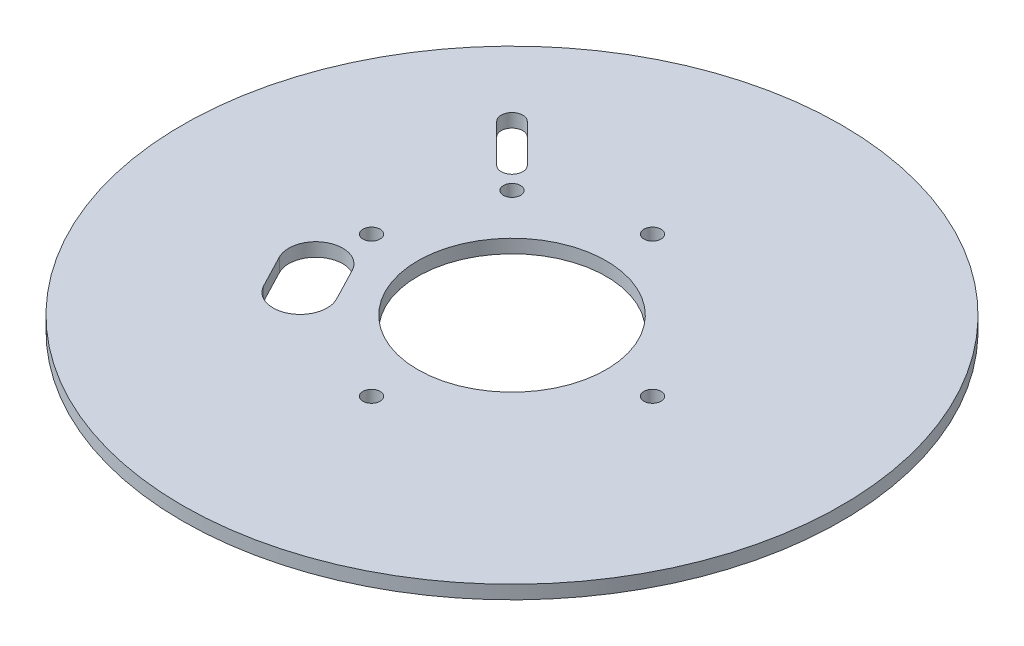
ISO-10303-21;
HEADER;
FILE_DESCRIPTION(('STEP AP214'),'2;1');
FILE_NAME('part.step','',(''),(''),'','','');
FILE_SCHEMA(('AUTOMOTIVE_DESIGN { 1 0 10303 214 1 1 1 1 }'));
ENDSEC;
DATA;
#1=APPLICATION_CONTEXT('core data for automotive mechanical design processes');
#2=APPLICATION_PROTOCOL_DEFINITION('international standard','automotive_design',2000,#1);
#3=PRODUCT_CONTEXT('',#1,'mechanical');
#4=PRODUCT('Part','Part','',(#3));
#5=PRODUCT_RELATED_PRODUCT_CATEGORY('part','',(#4));
#6=PRODUCT_DEFINITION_FORMATION('','',#4);
#7=PRODUCT_DEFINITION_CONTEXT('part definition',#1,'design');
#8=PRODUCT_DEFINITION('design','',#6,#7);
#9=PRODUCT_DEFINITION_SHAPE('','',#8);
#10=(LENGTH_UNIT() NAMED_UNIT(*) SI_UNIT(.MILLI.,.METRE.));
#11=(NAMED_UNIT(*) PLANE_ANGLE_UNIT() SI_UNIT($,.RADIAN.));
#12=(NAMED_UNIT(*) SI_UNIT($,.STERADIAN.) SOLID_ANGLE_UNIT());
#13=UNCERTAINTY_MEASURE_WITH_UNIT(LENGTH_MEASURE(1.E-05),#10,'distance_accuracy_value','');
#14=(GEOMETRIC_REPRESENTATION_CONTEXT(3) GLOBAL_UNCERTAINTY_ASSIGNED_CONTEXT((#13)) GLOBAL_UNIT_ASSIGNED_CONTEXT((#10,
#11,#12)) REPRESENTATION_CONTEXT('',''));
#15=CARTESIAN_POINT('',(0.,0.,0.));
#16=DIRECTION('',(0.,0.,1.));
#17=DIRECTION('',(1.,0.,0.));
#18=AXIS2_PLACEMENT_3D('',#15,#16,#17);
#19=CARTESIAN_POINT('',(0.,3.175,0.));
#20=DIRECTION('',(0.,-1.,0.));
#21=DIRECTION('',(0.,0.,-1.));
#22=AXIS2_PLACEMENT_3D('',#19,#20,#21);
#23=CYLINDRICAL_SURFACE('',#22,77.4600051);
#24=CARTESIAN_POINT('',(0.,3.175,0.));
#25=DIRECTION('',(0.,1.,0.));
#26=DIRECTION('',(0.,0.,1.));
#27=AXIS2_PLACEMENT_3D('',#24,#25,#26);
#28=CIRCLE('',#27,77.4600051);
#29=CARTESIAN_POINT('',(0.,3.175,77.4600051));
#30=VERTEX_POINT('',#29);
#31=EDGE_CURVE('E11',#30,#30,#28,.T.);
#32=ORIENTED_EDGE('',*,*,#31,.F.);
#33=EDGE_LOOP('',(#32));
#34=FACE_BOUND('',#33,.T.);
#35=CARTESIAN_POINT('',(0.,0.,0.));
#36=DIRECTION('',(0.,1.,0.));
#37=DIRECTION('',(0.,0.,1.));
#38=AXIS2_PLACEMENT_3D('',#35,#36,#37);
#39=CIRCLE('',#38,77.4600051);
#40=CARTESIAN_POINT('',(0.,0.,77.4600051));
#41=VERTEX_POINT('',#40);
#42=EDGE_CURVE('E38',#41,#41,#39,.T.);
#43=ORIENTED_EDGE('',*,*,#42,.T.);
#44=EDGE_LOOP('',(#43));
#45=FACE_BOUND('',#44,.T.);
#46=ADVANCED_FACE('F35',(#34,#45),#23,.T.);
#47=CARTESIAN_POINT('',(0.,3.175,0.));
#48=DIRECTION('',(0.,1.,0.));
#49=DIRECTION('',(0.,0.,1.));
#50=AXIS2_PLACEMENT_3D('',#47,#48,#49);
#51=PLANE('',#50);
#52=CARTESIAN_POINT('',(0.,3.175,33.02));
#53=DIRECTION('',(0.,1.,0.));
#54=DIRECTION('',(0.,0.,1.));
#55=AXIS2_PLACEMENT_3D('',#52,#53,#54);
#56=CIRCLE('',#55,2.0193);
#57=CARTESIAN_POINT('',(0.,3.175,35.0393));
#58=VERTEX_POINT('',#57);
#59=EDGE_CURVE('E173',#58,#58,#56,.T.);
#60=ORIENTED_EDGE('',*,*,#59,.F.);
#61=EDGE_LOOP('',(#60));
#62=FACE_BOUND('',#61,.T.);
#63=CARTESIAN_POINT('',(-33.02,3.175,0.));
#64=DIRECTION('',(0.,1.,0.));
#65=DIRECTION('',(0.,0.,1.));
#66=AXIS2_PLACEMENT_3D('',#63,#64,#65);
#67=CIRCLE('',#66,2.0193);
#68=CARTESIAN_POINT('',(-33.02,3.175,2.0193));
#69=VERTEX_POINT('',#68);
#70=EDGE_CURVE('E136',#69,#69,#67,.T.);
#71=ORIENTED_EDGE('',*,*,#70,.F.);
#72=EDGE_LOOP('',(#71));
#73=FACE_BOUND('',#72,.T.);
#74=CARTESIAN_POINT('',(-30.48,3.175,-30.48));
#75=DIRECTION('',(0.,1.,0.));
#76=DIRECTION('',(0.,0.,1.));
#77=AXIS2_PLACEMENT_3D('',#74,#75,#76);
#78=CIRCLE('',#77,2.54);
#79=CARTESIAN_POINT('',(-32.2760512242138,3.175,-28.6839487757862));
#80=VERTEX_POINT('',#79);
#81=CARTESIAN_POINT('',(-28.6839487757862,3.175,-32.2760512242138));
#82=VERTEX_POINT('',#81);
#83=EDGE_CURVE('E49',#80,#82,#78,.T.);
#84=ORIENTED_EDGE('',*,*,#83,.F.);
#85=DIRECTION('',(0.707106781186548,0.,0.707106781186547));
#86=VECTOR('',#85,1.);
#87=CARTESIAN_POINT('',(-32.2760512242138,3.175,-28.6839487757862));
#88=LINE('',#87,#86);
#89=CARTESIAN_POINT('',(-41.256307345283,3.175,-37.6642048968553));
#90=VERTEX_POINT('',#89);
#91=EDGE_CURVE('E120',#90,#80,#88,.T.);
#92=ORIENTED_EDGE('',*,*,#91,.F.);
#93=CARTESIAN_POINT('',(-39.4602561210692,3.175,-39.4602561210691));
#94=DIRECTION('',(0.,1.,0.));
#95=DIRECTION('',(0.,0.,1.));
#96=AXIS2_PLACEMENT_3D('',#93,#94,#95);
#97=CIRCLE('',#96,2.54000000000001);
#98=CARTESIAN_POINT('',(-37.6642048968553,3.175,-41.256307345283));
#99=VERTEX_POINT('',#98);
#100=EDGE_CURVE('E123',#99,#90,#97,.T.);
#101=ORIENTED_EDGE('',*,*,#100,.F.);
#102=DIRECTION('',(-0.707106781186547,0.,-0.707106781186548));
#103=VECTOR('',#102,1.);
#104=CARTESIAN_POINT('',(-28.6839487757862,3.175,-32.2760512242138));
#105=LINE('',#104,#103);
#106=EDGE_CURVE('E129',#82,#99,#105,.T.);
#107=ORIENTED_EDGE('',*,*,#106,.F.);
#108=EDGE_LOOP('',(#84,#92,#101,#107));
#109=FACE_BOUND('',#108,.T.);
#110=CARTESIAN_POINT('',(-33.5359357397664,3.175,12.5896679089743));
#111=DIRECTION('',(0.,1.,0.));
#112=DIRECTION('',(0.,0.,1.));
#113=AXIS2_PLACEMENT_3D('',#110,#111,#112);
#114=CIRCLE('',#113,6.35);
#115=CARTESIAN_POINT('',(-27.9034169490847,3.175,9.65756421493182));
#116=VERTEX_POINT('',#115);
#117=CARTESIAN_POINT('',(-39.1684545304481,3.175,15.5217716030168));
#118=VERTEX_POINT('',#117);
#119=EDGE_CURVE('E57',#116,#118,#114,.T.);
#120=ORIENTED_EDGE('',*,*,#119,.F.);
#121=DIRECTION('',(-0.461748613235035,0.,-0.887010833178221));
#122=VECTOR('',#121,1.);
#123=CARTESIAN_POINT('',(-27.9034169490847,3.175,9.65756421493182));
#124=LINE('',#123,#122);
#125=CARTESIAN_POINT('',(-23.9157559251869,3.175,17.3177897702589));
#126=VERTEX_POINT('',#125);
#127=EDGE_CURVE('E144',#126,#116,#124,.T.);
#128=ORIENTED_EDGE('',*,*,#127,.F.);
#129=CARTESIAN_POINT('',(-29.5482747158686,3.175,20.2498934643014));
#130=DIRECTION('',(0.,1.,0.));
#131=DIRECTION('',(0.,0.,1.));
#132=AXIS2_PLACEMENT_3D('',#129,#130,#131);
#133=CIRCLE('',#132,6.35);
#134=CARTESIAN_POINT('',(-35.1807935065504,3.175,23.1819971583439));
#135=VERTEX_POINT('',#134);
#136=EDGE_CURVE('E158',#135,#126,#133,.T.);
#137=ORIENTED_EDGE('',*,*,#136,.F.);
#138=DIRECTION('',(0.461748613235035,0.,0.887010833178221));
#139=VECTOR('',#138,1.);
#140=CARTESIAN_POINT('',(-39.1684545304481,3.175,15.5217716030168));
#141=LINE('',#140,#139);
#142=EDGE_CURVE('E155',#118,#135,#141,.T.);
#143=ORIENTED_EDGE('',*,*,#142,.F.);
#144=EDGE_LOOP('',(#120,#128,#137,#143));
#145=FACE_BOUND('',#144,.T.);
#146=CARTESIAN_POINT('',(33.02,3.175,0.));
#147=DIRECTION('',(0.,1.,0.));
#148=DIRECTION('',(0.,0.,1.));
#149=AXIS2_PLACEMENT_3D('',#146,#147,#148);
#150=CIRCLE('',#149,2.0193);
#151=CARTESIAN_POINT('',(33.02,3.175,2.0193));
#152=VERTEX_POINT('',#151);
#153=EDGE_CURVE('E172',#152,#152,#150,.T.);
#154=ORIENTED_EDGE('',*,*,#153,.F.);
#155=EDGE_LOOP('',(#154));
#156=FACE_BOUND('',#155,.T.);
#157=CARTESIAN_POINT('',(0.,3.175,-33.02));
#158=DIRECTION('',(0.,1.,0.));
#159=DIRECTION('',(0.,0.,1.));
#160=AXIS2_PLACEMENT_3D('',#157,#158,#159);
#161=CIRCLE('',#160,2.0193);
#162=CARTESIAN_POINT('',(0.,3.175,-31.0007));
#163=VERTEX_POINT('',#162);
#164=EDGE_CURVE('E191',#163,#163,#161,.T.);
#165=ORIENTED_EDGE('',*,*,#164,.F.);
#166=EDGE_LOOP('',(#165));
#167=FACE_BOUND('',#166,.T.);
#168=CARTESIAN_POINT('',(-25.4,3.175,-25.4));
#169=DIRECTION('',(0.,1.,0.));
#170=DIRECTION('',(0.,0.,1.));
#171=AXIS2_PLACEMENT_3D('',#168,#169,#170);
#172=CIRCLE('',#171,2.0193);
#173=CARTESIAN_POINT('',(-25.4,3.175,-23.3807));
#174=VERTEX_POINT('',#173);
#175=EDGE_CURVE('E185',#174,#174,#172,.T.);
#176=ORIENTED_EDGE('',*,*,#175,.F.);
#177=EDGE_LOOP('',(#176));
#178=FACE_BOUND('',#177,.T.);
#179=CARTESIAN_POINT('',(0.,3.175,0.));
#180=DIRECTION('',(0.,1.,0.));
#181=DIRECTION('',(0.,0.,1.));
#182=AXIS2_PLACEMENT_3D('',#179,#180,#181);
#183=CIRCLE('',#182,22.1615);
#184=CARTESIAN_POINT('',(0.,3.175,22.1615));
#185=VERTEX_POINT('',#184);
#186=EDGE_CURVE('E184',#185,#185,#183,.T.);
#187=ORIENTED_EDGE('',*,*,#186,.F.);
#188=EDGE_LOOP('',(#187));
#189=FACE_BOUND('',#188,.T.);
#190=ORIENTED_EDGE('',*,*,#31,.T.);
#191=EDGE_LOOP('',(#190));
#192=FACE_BOUND('',#191,.T.);
#193=ADVANCED_FACE('F207',(#62,#73,#109,#145,#156,#167,#178,#189,#192),#51,.T.);
#194=CARTESIAN_POINT('',(0.,0.,0.));
#195=DIRECTION('',(0.,1.,0.));
#196=DIRECTION('',(0.,0.,1.));
#197=AXIS2_PLACEMENT_3D('',#194,#195,#196);
#198=PLANE('',#197);
#199=CARTESIAN_POINT('',(0.,0.,33.02));
#200=DIRECTION('',(0.,1.,0.));
#201=DIRECTION('',(0.,0.,1.));
#202=AXIS2_PLACEMENT_3D('',#199,#200,#201);
#203=CIRCLE('',#202,2.0193);
#204=CARTESIAN_POINT('',(0.,0.,35.0393));
#205=VERTEX_POINT('',#204);
#206=EDGE_CURVE('E169',#205,#205,#203,.T.);
#207=ORIENTED_EDGE('',*,*,#206,.T.);
#208=EDGE_LOOP('',(#207));
#209=FACE_BOUND('',#208,.T.);
#210=CARTESIAN_POINT('',(-33.02,0.,0.));
#211=DIRECTION('',(0.,1.,0.));
#212=DIRECTION('',(0.,0.,1.));
#213=AXIS2_PLACEMENT_3D('',#210,#211,#212);
#214=CIRCLE('',#213,2.0193);
#215=CARTESIAN_POINT('',(-33.02,0.,2.0193));
#216=VERTEX_POINT('',#215);
#217=EDGE_CURVE('E176',#216,#216,#214,.T.);
#218=ORIENTED_EDGE('',*,*,#217,.T.);
#219=EDGE_LOOP('',(#218));
#220=FACE_BOUND('',#219,.T.);
#221=DIRECTION('',(0.707106781186548,0.,0.707106781186547));
#222=VECTOR('',#221,1.);
#223=CARTESIAN_POINT('',(-32.2760512242138,0.,-28.6839487757862));
#224=LINE('',#223,#222);
#225=CARTESIAN_POINT('',(-41.256307345283,0.,-37.6642048968553));
#226=VERTEX_POINT('',#225);
#227=CARTESIAN_POINT('',(-32.2760512242138,0.,-28.6839487757862));
#228=VERTEX_POINT('',#227);
#229=EDGE_CURVE('E107',#226,#228,#224,.T.);
#230=ORIENTED_EDGE('',*,*,#229,.T.);
#231=CARTESIAN_POINT('',(-30.48,0.,-30.48));
#232=DIRECTION('',(0.,1.,0.));
#233=DIRECTION('',(0.,0.,1.));
#234=AXIS2_PLACEMENT_3D('',#231,#232,#233);
#235=CIRCLE('',#234,2.54);
#236=CARTESIAN_POINT('',(-28.6839487757862,0.,-32.2760512242138));
#237=VERTEX_POINT('',#236);
#238=EDGE_CURVE('E101',#228,#237,#235,.T.);
#239=ORIENTED_EDGE('',*,*,#238,.T.);
#240=DIRECTION('',(-0.707106781186547,0.,-0.707106781186548));
#241=VECTOR('',#240,1.);
#242=CARTESIAN_POINT('',(-28.6839487757862,0.,-32.2760512242138));
#243=LINE('',#242,#241);
#244=CARTESIAN_POINT('',(-37.6642048968553,0.,-41.256307345283));
#245=VERTEX_POINT('',#244);
#246=EDGE_CURVE('E111',#237,#245,#243,.T.);
#247=ORIENTED_EDGE('',*,*,#246,.T.);
#248=CARTESIAN_POINT('',(-39.4602561210692,0.,-39.4602561210691));
#249=DIRECTION('',(0.,1.,0.));
#250=DIRECTION('',(0.,0.,1.));
#251=AXIS2_PLACEMENT_3D('',#248,#249,#250);
#252=CIRCLE('',#251,2.54000000000001);
#253=EDGE_CURVE('E115',#245,#226,#252,.T.);
#254=ORIENTED_EDGE('',*,*,#253,.T.);
#255=EDGE_LOOP('',(#230,#239,#247,#254));
#256=FACE_BOUND('',#255,.T.);
#257=DIRECTION('',(-0.461748613235035,0.,-0.887010833178221));
#258=VECTOR('',#257,1.);
#259=CARTESIAN_POINT('',(-27.9034169490847,0.,9.65756421493182));
#260=LINE('',#259,#258);
#261=CARTESIAN_POINT('',(-23.9157559251869,0.,17.3177897702589));
#262=VERTEX_POINT('',#261);
#263=CARTESIAN_POINT('',(-27.9034169490847,0.,9.65756421493182));
#264=VERTEX_POINT('',#263);
#265=EDGE_CURVE('E150',#262,#264,#260,.T.);
#266=ORIENTED_EDGE('',*,*,#265,.T.);
#267=CARTESIAN_POINT('',(-33.5359357397664,0.,12.5896679089743));
#268=DIRECTION('',(0.,1.,0.));
#269=DIRECTION('',(0.,0.,1.));
#270=AXIS2_PLACEMENT_3D('',#267,#268,#269);
#271=CIRCLE('',#270,6.35);
#272=CARTESIAN_POINT('',(-39.1684545304481,0.,15.5217716030168));
#273=VERTEX_POINT('',#272);
#274=EDGE_CURVE('E140',#264,#273,#271,.T.);
#275=ORIENTED_EDGE('',*,*,#274,.T.);
#276=DIRECTION('',(0.461748613235035,0.,0.887010833178221));
#277=VECTOR('',#276,1.);
#278=CARTESIAN_POINT('',(-39.1684545304481,0.,15.5217716030168));
#279=LINE('',#278,#277);
#280=CARTESIAN_POINT('',(-35.1807935065504,0.,23.1819971583439));
#281=VERTEX_POINT('',#280);
#282=EDGE_CURVE('E143',#273,#281,#279,.T.);
#283=ORIENTED_EDGE('',*,*,#282,.T.);
#284=CARTESIAN_POINT('',(-29.5482747158686,0.,20.2498934643014));
#285=DIRECTION('',(0.,1.,0.));
#286=DIRECTION('',(0.,0.,1.));
#287=AXIS2_PLACEMENT_3D('',#284,#285,#286);
#288=CIRCLE('',#287,6.35);
#289=EDGE_CURVE('E147',#281,#262,#288,.T.);
#290=ORIENTED_EDGE('',*,*,#289,.T.);
#291=EDGE_LOOP('',(#266,#275,#283,#290));
#292=FACE_BOUND('',#291,.T.);
#293=CARTESIAN_POINT('',(33.02,0.,0.));
#294=DIRECTION('',(0.,1.,0.));
#295=DIRECTION('',(0.,0.,1.));
#296=AXIS2_PLACEMENT_3D('',#293,#294,#295);
#297=CIRCLE('',#296,2.0193);
#298=CARTESIAN_POINT('',(33.02,0.,2.0193));
#299=VERTEX_POINT('',#298);
#300=EDGE_CURVE('E194',#299,#299,#297,.T.);
#301=ORIENTED_EDGE('',*,*,#300,.T.);
#302=EDGE_LOOP('',(#301));
#303=FACE_BOUND('',#302,.T.);
#304=CARTESIAN_POINT('',(0.,0.,-33.02));
#305=DIRECTION('',(0.,1.,0.));
#306=DIRECTION('',(0.,0.,1.));
#307=AXIS2_PLACEMENT_3D('',#304,#305,#306);
#308=CIRCLE('',#307,2.0193);
#309=CARTESIAN_POINT('',(0.,0.,-31.0007));
#310=VERTEX_POINT('',#309);
#311=EDGE_CURVE('E188',#310,#310,#308,.T.);
#312=ORIENTED_EDGE('',*,*,#311,.T.);
#313=EDGE_LOOP('',(#312));
#314=FACE_BOUND('',#313,.T.);
#315=CARTESIAN_POINT('',(-25.4,0.,-25.4));
#316=DIRECTION('',(0.,1.,0.));
#317=DIRECTION('',(0.,0.,1.));
#318=AXIS2_PLACEMENT_3D('',#315,#316,#317);
#319=CIRCLE('',#318,2.0193);
#320=CARTESIAN_POINT('',(-25.4,0.,-23.3807));
#321=VERTEX_POINT('',#320);
#322=EDGE_CURVE('E181',#321,#321,#319,.T.);
#323=ORIENTED_EDGE('',*,*,#322,.T.);
#324=EDGE_LOOP('',(#323));
#325=FACE_BOUND('',#324,.T.);
#326=CARTESIAN_POINT('',(0.,0.,0.));
#327=DIRECTION('',(0.,1.,0.));
#328=DIRECTION('',(0.,0.,1.));
#329=AXIS2_PLACEMENT_3D('',#326,#327,#328);
#330=CIRCLE('',#329,22.1615);
#331=CARTESIAN_POINT('',(0.,0.,22.1615));
#332=VERTEX_POINT('',#331);
#333=EDGE_CURVE('E199',#332,#332,#330,.T.);
#334=ORIENTED_EDGE('',*,*,#333,.T.);
#335=EDGE_LOOP('',(#334));
#336=FACE_BOUND('',#335,.T.);
#337=ORIENTED_EDGE('',*,*,#42,.F.);
#338=EDGE_LOOP('',(#337));
#339=FACE_BOUND('',#338,.T.);
#340=ADVANCED_FACE('F117',(#209,#220,#256,#292,#303,#314,#325,#336,#339),#198,.F.);
#341=CARTESIAN_POINT('',(0.,0.,0.));
#342=DIRECTION('',(0.,1.,0.));
#343=DIRECTION('',(0.,0.,1.));
#344=AXIS2_PLACEMENT_3D('',#341,#342,#343);
#345=CYLINDRICAL_SURFACE('',#344,22.1615);
#346=ORIENTED_EDGE('',*,*,#333,.F.);
#347=EDGE_LOOP('',(#346));
#348=FACE_BOUND('',#347,.T.);
#349=ORIENTED_EDGE('',*,*,#186,.T.);
#350=EDGE_LOOP('',(#349));
#351=FACE_BOUND('',#350,.T.);
#352=ADVANCED_FACE('F205',(#348,#351),#345,.F.);
#353=CARTESIAN_POINT('',(-25.4,0.,-25.4));
#354=DIRECTION('',(0.,1.,0.));
#355=DIRECTION('',(0.,0.,1.));
#356=AXIS2_PLACEMENT_3D('',#353,#354,#355);
#357=CYLINDRICAL_SURFACE('',#356,2.0193);
#358=ORIENTED_EDGE('',*,*,#322,.F.);
#359=EDGE_LOOP('',(#358));
#360=FACE_BOUND('',#359,.T.);
#361=ORIENTED_EDGE('',*,*,#175,.T.);
#362=EDGE_LOOP('',(#361));
#363=FACE_BOUND('',#362,.T.);
#364=ADVANCED_FACE('F224',(#360,#363),#357,.F.);
#365=CARTESIAN_POINT('',(0.,0.,-33.02));
#366=DIRECTION('',(0.,1.,0.));
#367=DIRECTION('',(0.,0.,1.));
#368=AXIS2_PLACEMENT_3D('',#365,#366,#367);
#369=CYLINDRICAL_SURFACE('',#368,2.0193);
#370=ORIENTED_EDGE('',*,*,#311,.F.);
#371=EDGE_LOOP('',(#370));
#372=FACE_BOUND('',#371,.T.);
#373=ORIENTED_EDGE('',*,*,#164,.T.);
#374=EDGE_LOOP('',(#373));
#375=FACE_BOUND('',#374,.T.);
#376=ADVANCED_FACE('F233',(#372,#375),#369,.F.);
#377=CARTESIAN_POINT('',(33.02,0.,0.));
#378=DIRECTION('',(0.,1.,0.));
#379=DIRECTION('',(0.,0.,1.));
#380=AXIS2_PLACEMENT_3D('',#377,#378,#379);
#381=CYLINDRICAL_SURFACE('',#380,2.0193);
#382=ORIENTED_EDGE('',*,*,#300,.F.);
#383=EDGE_LOOP('',(#382));
#384=FACE_BOUND('',#383,.T.);
#385=ORIENTED_EDGE('',*,*,#153,.T.);
#386=EDGE_LOOP('',(#385));
#387=FACE_BOUND('',#386,.T.);
#388=ADVANCED_FACE('F229',(#384,#387),#381,.F.);
#389=CARTESIAN_POINT('',(-33.5359357397664,0.,12.5896679089743));
#390=DIRECTION('',(0.,1.,0.));
#391=DIRECTION('',(0.,0.,1.));
#392=AXIS2_PLACEMENT_3D('',#389,#390,#391);
#393=CYLINDRICAL_SURFACE('',#392,6.35);
#394=ORIENTED_EDGE('',*,*,#119,.T.);
#395=DIRECTION('',(0.,1.,0.));
#396=VECTOR('',#395,1.);
#397=CARTESIAN_POINT('',(-39.1684545304481,0.,15.5217716030168));
#398=LINE('',#397,#396);
#399=EDGE_CURVE('E153',#273,#118,#398,.T.);
#400=ORIENTED_EDGE('',*,*,#399,.F.);
#401=ORIENTED_EDGE('',*,*,#274,.F.);
#402=DIRECTION('',(0.,1.,0.));
#403=VECTOR('',#402,1.);
#404=CARTESIAN_POINT('',(-27.9034169490847,0.,9.65756421493182));
#405=LINE('',#404,#403);
#406=EDGE_CURVE('E130',#264,#116,#405,.T.);
#407=ORIENTED_EDGE('',*,*,#406,.T.);
#408=EDGE_LOOP('',(#394,#400,#401,#407));
#409=FACE_BOUND('',#408,.T.);
#410=ADVANCED_FACE('F232',(#409),#393,.F.);
#411=CARTESIAN_POINT('',(-27.9034169490847,0.,9.65756421493182));
#412=DIRECTION('',(0.887010833178221,0.,-0.461748613235035));
#413=DIRECTION('',(-0.461748613235035,0.,-0.887010833178221));
#414=AXIS2_PLACEMENT_3D('',#411,#412,#413);
#415=PLANE('',#414);
#416=ORIENTED_EDGE('',*,*,#127,.T.);
#417=ORIENTED_EDGE('',*,*,#406,.F.);
#418=ORIENTED_EDGE('',*,*,#265,.F.);
#419=DIRECTION('',(0.,1.,0.));
#420=VECTOR('',#419,1.);
#421=CARTESIAN_POINT('',(-23.9157559251869,0.,17.3177897702589));
#422=LINE('',#421,#420);
#423=EDGE_CURVE('E164',#262,#126,#422,.T.);
#424=ORIENTED_EDGE('',*,*,#423,.T.);
#425=EDGE_LOOP('',(#416,#417,#418,#424));
#426=FACE_BOUND('',#425,.T.);
#427=ADVANCED_FACE('F251',(#426),#415,.F.);
#428=CARTESIAN_POINT('',(-29.5482747158686,0.,20.2498934643014));
#429=DIRECTION('',(0.,1.,0.));
#430=DIRECTION('',(0.,0.,1.));
#431=AXIS2_PLACEMENT_3D('',#428,#429,#430);
#432=CYLINDRICAL_SURFACE('',#431,6.35);
#433=ORIENTED_EDGE('',*,*,#136,.T.);
#434=ORIENTED_EDGE('',*,*,#423,.F.);
#435=ORIENTED_EDGE('',*,*,#289,.F.);
#436=DIRECTION('',(0.,1.,0.));
#437=VECTOR('',#436,1.);
#438=CARTESIAN_POINT('',(-35.1807935065504,0.,23.1819971583439));
#439=LINE('',#438,#437);
#440=EDGE_CURVE('E166',#281,#135,#439,.T.);
#441=ORIENTED_EDGE('',*,*,#440,.T.);
#442=EDGE_LOOP('',(#433,#434,#435,#441));
#443=FACE_BOUND('',#442,.T.);
#444=ADVANCED_FACE('F255',(#443),#432,.F.);
#445=CARTESIAN_POINT('',(-39.1684545304481,0.,15.5217716030168));
#446=DIRECTION('',(-0.887010833178221,0.,0.461748613235035));
#447=DIRECTION('',(0.461748613235035,0.,0.887010833178221));
#448=AXIS2_PLACEMENT_3D('',#445,#446,#447);
#449=PLANE('',#448);
#450=ORIENTED_EDGE('',*,*,#142,.T.);
#451=ORIENTED_EDGE('',*,*,#440,.F.);
#452=ORIENTED_EDGE('',*,*,#282,.F.);
#453=ORIENTED_EDGE('',*,*,#399,.T.);
#454=EDGE_LOOP('',(#450,#451,#452,#453));
#455=FACE_BOUND('',#454,.T.);
#456=ADVANCED_FACE('F252',(#455),#449,.F.);
#457=CARTESIAN_POINT('',(-30.48,0.,-30.48));
#458=DIRECTION('',(0.,1.,0.));
#459=DIRECTION('',(0.,0.,1.));
#460=AXIS2_PLACEMENT_3D('',#457,#458,#459);
#461=CYLINDRICAL_SURFACE('',#460,2.54);
#462=ORIENTED_EDGE('',*,*,#83,.T.);
#463=DIRECTION('',(0.,1.,0.));
#464=VECTOR('',#463,1.);
#465=CARTESIAN_POINT('',(-28.6839487757862,0.,-32.2760512242138));
#466=LINE('',#465,#464);
#467=EDGE_CURVE('E97',#237,#82,#466,.T.);
#468=ORIENTED_EDGE('',*,*,#467,.F.);
#469=ORIENTED_EDGE('',*,*,#238,.F.);
#470=DIRECTION('',(0.,1.,0.));
#471=VECTOR('',#470,1.);
#472=CARTESIAN_POINT('',(-32.2760512242138,0.,-28.6839487757862));
#473=LINE('',#472,#471);
#474=EDGE_CURVE('E134',#228,#80,#473,.T.);
#475=ORIENTED_EDGE('',*,*,#474,.T.);
#476=EDGE_LOOP('',(#462,#468,#469,#475));
#477=FACE_BOUND('',#476,.T.);
#478=ADVANCED_FACE('F99',(#477),#461,.F.);
#479=CARTESIAN_POINT('',(-32.2760512242138,0.,-28.6839487757862));
#480=DIRECTION('',(-0.707106781186547,0.,0.707106781186548));
#481=DIRECTION('',(0.707106781186548,0.,0.707106781186547));
#482=AXIS2_PLACEMENT_3D('',#479,#480,#481);
#483=PLANE('',#482);
#484=ORIENTED_EDGE('',*,*,#91,.T.);
#485=ORIENTED_EDGE('',*,*,#474,.F.);
#486=ORIENTED_EDGE('',*,*,#229,.F.);
#487=DIRECTION('',(0.,1.,0.));
#488=VECTOR('',#487,1.);
#489=CARTESIAN_POINT('',(-41.256307345283,0.,-37.6642048968553));
#490=LINE('',#489,#488);
#491=EDGE_CURVE('E137',#226,#90,#490,.T.);
#492=ORIENTED_EDGE('',*,*,#491,.T.);
#493=EDGE_LOOP('',(#484,#485,#486,#492));
#494=FACE_BOUND('',#493,.T.);
#495=ADVANCED_FACE('F265',(#494),#483,.F.);
#496=CARTESIAN_POINT('',(-39.4602561210692,0.,-39.4602561210691));
#497=DIRECTION('',(0.,1.,0.));
#498=DIRECTION('',(0.,0.,1.));
#499=AXIS2_PLACEMENT_3D('',#496,#497,#498);
#500=CYLINDRICAL_SURFACE('',#499,2.54000000000001);
#501=ORIENTED_EDGE('',*,*,#100,.T.);
#502=ORIENTED_EDGE('',*,*,#491,.F.);
#503=ORIENTED_EDGE('',*,*,#253,.F.);
#504=DIRECTION('',(0.,1.,0.));
#505=VECTOR('',#504,1.);
#506=CARTESIAN_POINT('',(-37.6642048968553,0.,-41.256307345283));
#507=LINE('',#506,#505);
#508=EDGE_CURVE('E106',#245,#99,#507,.T.);
#509=ORIENTED_EDGE('',*,*,#508,.T.);
#510=EDGE_LOOP('',(#501,#502,#503,#509));
#511=FACE_BOUND('',#510,.T.);
#512=ADVANCED_FACE('F268',(#511),#500,.F.);
#513=CARTESIAN_POINT('',(-28.6839487757862,0.,-32.2760512242138));
#514=DIRECTION('',(0.707106781186548,0.,-0.707106781186547));
#515=DIRECTION('',(-0.707106781186547,0.,-0.707106781186548));
#516=AXIS2_PLACEMENT_3D('',#513,#514,#515);
#517=PLANE('',#516);
#518=ORIENTED_EDGE('',*,*,#106,.T.);
#519=ORIENTED_EDGE('',*,*,#508,.F.);
#520=ORIENTED_EDGE('',*,*,#246,.F.);
#521=ORIENTED_EDGE('',*,*,#467,.T.);
#522=EDGE_LOOP('',(#518,#519,#520,#521));
#523=FACE_BOUND('',#522,.T.);
#524=ADVANCED_FACE('F112',(#523),#517,.F.);
#525=CARTESIAN_POINT('',(-33.02,0.,0.));
#526=DIRECTION('',(0.,1.,0.));
#527=DIRECTION('',(0.,0.,1.));
#528=AXIS2_PLACEMENT_3D('',#525,#526,#527);
#529=CYLINDRICAL_SURFACE('',#528,2.0193);
#530=ORIENTED_EDGE('',*,*,#217,.F.);
#531=EDGE_LOOP('',(#530));
#532=FACE_BOUND('',#531,.T.);
#533=ORIENTED_EDGE('',*,*,#70,.T.);
#534=EDGE_LOOP('',(#533));
#535=FACE_BOUND('',#534,.T.);
#536=ADVANCED_FACE('F241',(#532,#535),#529,.F.);
#537=CARTESIAN_POINT('',(0.,0.,33.02));
#538=DIRECTION('',(0.,1.,0.));
#539=DIRECTION('',(0.,0.,1.));
#540=AXIS2_PLACEMENT_3D('',#537,#538,#539);
#541=CYLINDRICAL_SURFACE('',#540,2.0193);
#542=ORIENTED_EDGE('',*,*,#206,.F.);
#543=EDGE_LOOP('',(#542));
#544=FACE_BOUND('',#543,.T.);
#545=ORIENTED_EDGE('',*,*,#59,.T.);
#546=EDGE_LOOP('',(#545));
#547=FACE_BOUND('',#546,.T.);
#548=ADVANCED_FACE('F244',(#544,#547),#541,.F.);
#549=CLOSED_SHELL('',(#46,#193,#340,#352,#364,#376,#388,#410,#427,#444,#456,#478,#495,#512,#524,
#536,#548));
#550=MANIFOLD_SOLID_BREP('B2',#549);
#551=ADVANCED_BREP_SHAPE_REPRESENTATION('',(#18,#550),#14);
#552=SHAPE_DEFINITION_REPRESENTATION(#9,#551);
ENDSEC;
END-ISO-10303-21;
